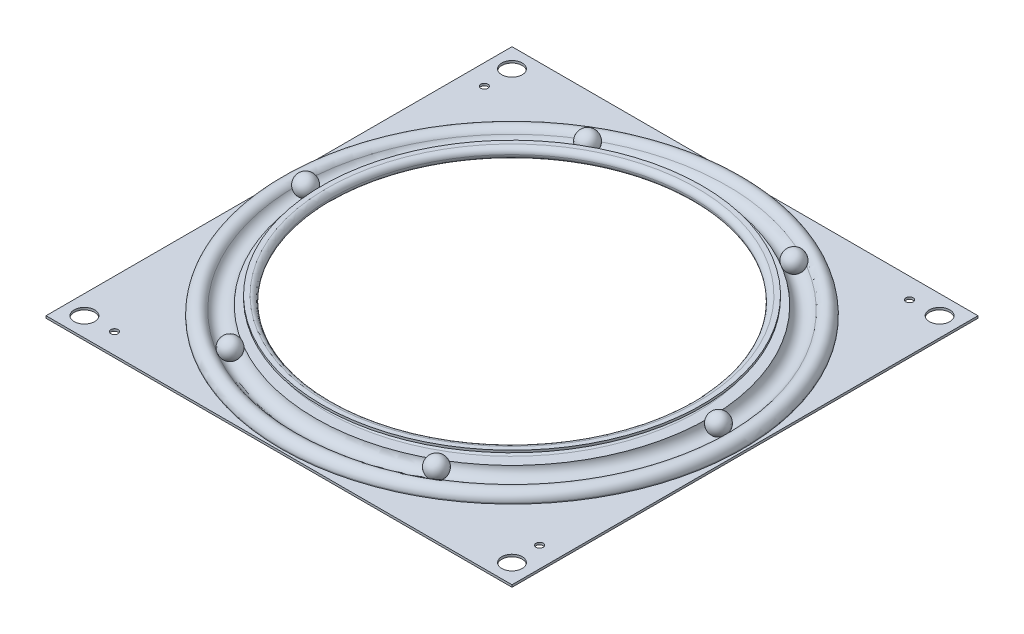
ISO-10303-21;
HEADER;
FILE_DESCRIPTION(('STEP AP214'),'2;1');
FILE_NAME('part.step','',(''),(''),'','','');
FILE_SCHEMA(('AUTOMOTIVE_DESIGN { 1 0 10303 214 1 1 1 1 }'));
ENDSEC;
DATA;
#1=APPLICATION_CONTEXT('core data for automotive mechanical design processes');
#2=APPLICATION_PROTOCOL_DEFINITION('international standard','automotive_design',2000,#1);
#3=PRODUCT_CONTEXT('',#1,'mechanical');
#4=PRODUCT('Part','Part','',(#3));
#5=PRODUCT_RELATED_PRODUCT_CATEGORY('part','',(#4));
#6=PRODUCT_DEFINITION_FORMATION('','',#4);
#7=PRODUCT_DEFINITION_CONTEXT('part definition',#1,'design');
#8=PRODUCT_DEFINITION('design','',#6,#7);
#9=PRODUCT_DEFINITION_SHAPE('','',#8);
#10=(LENGTH_UNIT() NAMED_UNIT(*) SI_UNIT(.MILLI.,.METRE.));
#11=(NAMED_UNIT(*) PLANE_ANGLE_UNIT() SI_UNIT($,.RADIAN.));
#12=(NAMED_UNIT(*) SI_UNIT($,.STERADIAN.) SOLID_ANGLE_UNIT());
#13=UNCERTAINTY_MEASURE_WITH_UNIT(LENGTH_MEASURE(1.E-05),#10,'distance_accuracy_value','');
#14=(GEOMETRIC_REPRESENTATION_CONTEXT(3) GLOBAL_UNCERTAINTY_ASSIGNED_CONTEXT((#13)) GLOBAL_UNIT_ASSIGNED_CONTEXT((#10,
#11,#12)) REPRESENTATION_CONTEXT('',''));
#15=CARTESIAN_POINT('',(0.,0.,0.));
#16=DIRECTION('',(0.,0.,1.));
#17=DIRECTION('',(1.,0.,0.));
#18=AXIS2_PLACEMENT_3D('',#15,#16,#17);
#19=CARTESIAN_POINT('',(34.1090250000007,-0.761999999999995,-59.0785642966366));
#20=DIRECTION('',(0.,1.,0.));
#21=DIRECTION('',(0.50000000000001,0.,-0.866025403784433));
#22=AXIS2_PLACEMENT_3D('',#19,#20,#21);
#23=SPHERICAL_SURFACE('',#22,3.27659999999999);
#24=CARTESIAN_POINT('',(34.1090250000007,2.5146,-59.0785642966366));
#25=VERTEX_POINT('',#24);
#26=VERTEX_LOOP('',#25);
#27=FACE_BOUND('',#26,.T.);
#28=ADVANCED_FACE('F41',(#27),#23,.T.);
#29=CLOSED_SHELL('',(#28));
#30=MANIFOLD_SOLID_BREP('B2',#29);
#31=CARTESIAN_POINT('',(-34.1090249999995,-0.761999999999995,-59.0785642966373));
#32=DIRECTION('',(0.,1.,0.));
#33=DIRECTION('',(-0.499999999999992,0.,-0.866025403784443));
#34=AXIS2_PLACEMENT_3D('',#31,#32,#33);
#35=SPHERICAL_SURFACE('',#34,3.27659999999999);
#36=CARTESIAN_POINT('',(-34.1090249999995,2.5146,-59.0785642966373));
#37=VERTEX_POINT('',#36);
#38=VERTEX_LOOP('',#37);
#39=FACE_BOUND('',#38,.T.);
#40=ADVANCED_FACE('F59',(#39),#35,.T.);
#41=CLOSED_SHELL('',(#40));
#42=MANIFOLD_SOLID_BREP('B6',#41);
#43=CARTESIAN_POINT('',(-68.21805,-0.761999999999995,-4.76364373004656E-13));
#44=DIRECTION('',(0.,1.,0.));
#45=DIRECTION('',(-1.,0.,0.));
#46=AXIS2_PLACEMENT_3D('',#43,#44,#45);
#47=SPHERICAL_SURFACE('',#46,3.27659999999999);
#48=CARTESIAN_POINT('',(-68.21805,2.5146,-4.76364373004656E-13));
#49=VERTEX_POINT('',#48);
#50=VERTEX_LOOP('',#49);
#51=FACE_BOUND('',#50,.T.);
#52=ADVANCED_FACE('F77',(#51),#47,.T.);
#53=CLOSED_SHELL('',(#52));
#54=MANIFOLD_SOLID_BREP('B37',#53);
#55=CARTESIAN_POINT('',(-34.1090250000003,-0.761999999999995,59.0785642966369));
#56=DIRECTION('',(0.,1.,0.));
#57=DIRECTION('',(-0.500000000000004,0.,0.866025403784436));
#58=AXIS2_PLACEMENT_3D('',#55,#56,#57);
#59=SPHERICAL_SURFACE('',#58,3.27659999999999);
#60=CARTESIAN_POINT('',(-34.1090250000003,2.5146,59.0785642966369));
#61=VERTEX_POINT('',#60);
#62=VERTEX_LOOP('',#61);
#63=FACE_BOUND('',#62,.T.);
#64=ADVANCED_FACE('F95',(#63),#59,.T.);
#65=CLOSED_SHELL('',(#64));
#66=MANIFOLD_SOLID_BREP('B55',#65);
#67=CARTESIAN_POINT('',(34.1090249999999,-0.761999999999995,59.0785642966371));
#68=DIRECTION('',(0.,1.,0.));
#69=DIRECTION('',(0.499999999999998,0.,0.86602540378444));
#70=AXIS2_PLACEMENT_3D('',#67,#68,#69);
#71=SPHERICAL_SURFACE('',#70,3.27659999999999);
#72=CARTESIAN_POINT('',(34.1090249999999,2.5146,59.0785642966371));
#73=VERTEX_POINT('',#72);
#74=VERTEX_LOOP('',#73);
#75=FACE_BOUND('',#74,.T.);
#76=ADVANCED_FACE('F113',(#75),#71,.T.);
#77=CLOSED_SHELL('',(#76));
#78=MANIFOLD_SOLID_BREP('B73',#77);
#79=CARTESIAN_POINT('',(68.21805,-0.761999999999995,0.));
#80=DIRECTION('',(0.,1.,0.));
#81=DIRECTION('',(1.,0.,0.));
#82=AXIS2_PLACEMENT_3D('',#79,#80,#81);
#83=SPHERICAL_SURFACE('',#82,3.27659999999999);
#84=CARTESIAN_POINT('',(68.21805,2.5146,0.));
#85=VERTEX_POINT('',#84);
#86=VERTEX_LOOP('',#85);
#87=FACE_BOUND('',#86,.T.);
#88=ADVANCED_FACE('F134',(#87),#83,.T.);
#89=CLOSED_SHELL('',(#88));
#90=MANIFOLD_SOLID_BREP('B91',#89);
#91=CARTESIAN_POINT('',(0.,0.,0.));
#92=DIRECTION('',(0.,1.,0.));
#93=DIRECTION('',(0.,0.,1.));
#94=AXIS2_PLACEMENT_3D('',#91,#92,#93);
#95=TOROIDAL_SURFACE('',#94,61.214,1.778);
#96=CARTESIAN_POINT('',(0.,-1.77799999999999,0.));
#97=DIRECTION('',(0.,1.,0.));
#98=DIRECTION('',(0.,0.,1.));
#99=AXIS2_PLACEMENT_3D('',#96,#97,#98);
#100=CIRCLE('',#99,61.214);
#101=CARTESIAN_POINT('',(0.,-1.77799999999999,61.214));
#102=VERTEX_POINT('',#101);
#103=EDGE_CURVE('E228',#102,#102,#100,.T.);
#104=ORIENTED_EDGE('',*,*,#103,.F.);
#105=EDGE_LOOP('',(#104));
#106=FACE_BOUND('',#105,.T.);
#107=CARTESIAN_POINT('',(0.,0.,0.));
#108=DIRECTION('',(0.,1.,0.));
#109=DIRECTION('',(0.,0.,1.));
#110=AXIS2_PLACEMENT_3D('',#107,#108,#109);
#111=CIRCLE('',#110,59.436);
#112=CARTESIAN_POINT('',(0.,0.,59.436));
#113=VERTEX_POINT('',#112);
#114=EDGE_CURVE('E132',#113,#113,#111,.T.);
#115=ORIENTED_EDGE('',*,*,#114,.T.);
#116=EDGE_LOOP('',(#115));
#117=FACE_BOUND('',#116,.T.);
#118=ADVANCED_FACE('F146',(#106,#117),#95,.T.);
#119=CARTESIAN_POINT('',(75.5293408614699,-4.82599999999999,0.));
#120=DIRECTION('',(0.,1.,0.));
#121=DIRECTION('',(0.,0.,1.));
#122=AXIS2_PLACEMENT_3D('',#119,#120,#121);
#123=PLANE('',#122);
#124=CARTESIAN_POINT('',(-61.1251000000008,-4.82599999999999,70.2436999999994));
#125=DIRECTION('',(0.,1.,0.));
#126=DIRECTION('',(0.,0.,1.));
#127=AXIS2_PLACEMENT_3D('',#124,#125,#126);
#128=CIRCLE('',#127,1.19062499999999);
#129=CARTESIAN_POINT('',(-61.1251000000008,-4.82599999999999,71.4343249999993));
#130=VERTEX_POINT('',#129);
#131=EDGE_CURVE('E545',#130,#130,#128,.T.);
#132=ORIENTED_EDGE('',*,*,#131,.T.);
#133=EDGE_LOOP('',(#132));
#134=FACE_BOUND('',#133,.T.);
#135=CARTESIAN_POINT('',(70.2436999999996,-4.82599999999999,61.1251000000005));
#136=DIRECTION('',(0.,1.,0.));
#137=DIRECTION('',(0.,0.,1.));
#138=AXIS2_PLACEMENT_3D('',#135,#136,#137);
#139=CIRCLE('',#138,1.19062499999999);
#140=CARTESIAN_POINT('',(70.2436999999996,-4.82599999999999,62.3157250000005));
#141=VERTEX_POINT('',#140);
#142=EDGE_CURVE('E549',#141,#141,#139,.T.);
#143=ORIENTED_EDGE('',*,*,#142,.T.);
#144=EDGE_LOOP('',(#143));
#145=FACE_BOUND('',#144,.T.);
#146=CARTESIAN_POINT('',(61.1251000000003,-4.82599999999999,-70.2436999999998));
#147=DIRECTION('',(0.,1.,0.));
#148=DIRECTION('',(0.,0.,1.));
#149=AXIS2_PLACEMENT_3D('',#146,#147,#148);
#150=CIRCLE('',#149,1.19062499999999);
#151=CARTESIAN_POINT('',(61.1251000000003,-4.82599999999999,-69.0530749999998));
#152=VERTEX_POINT('',#151);
#153=EDGE_CURVE('E558',#152,#152,#150,.T.);
#154=ORIENTED_EDGE('',*,*,#153,.T.);
#155=EDGE_LOOP('',(#154));
#156=FACE_BOUND('',#155,.T.);
#157=CARTESIAN_POINT('',(-70.2437,-4.82599999999999,-61.1251));
#158=DIRECTION('',(0.,1.,0.));
#159=DIRECTION('',(0.,0.,1.));
#160=AXIS2_PLACEMENT_3D('',#157,#158,#159);
#161=CIRCLE('',#160,1.19062499999999);
#162=CARTESIAN_POINT('',(-70.2437,-4.82599999999999,-59.934475));
#163=VERTEX_POINT('',#162);
#164=EDGE_CURVE('E564',#163,#163,#161,.T.);
#165=ORIENTED_EDGE('',*,*,#164,.T.);
#166=EDGE_LOOP('',(#165));
#167=FACE_BOUND('',#166,.T.);
#168=CARTESIAN_POINT('',(70.6501,-4.826,-70.6501));
#169=DIRECTION('',(0.,1.,0.));
#170=DIRECTION('',(0.,0.,1.));
#171=AXIS2_PLACEMENT_3D('',#168,#169,#170);
#172=CIRCLE('',#171,3.3782);
#173=CARTESIAN_POINT('',(70.6501,-4.826,-67.2719));
#174=VERTEX_POINT('',#173);
#175=EDGE_CURVE('E567',#174,#174,#172,.T.);
#176=ORIENTED_EDGE('',*,*,#175,.T.);
#177=EDGE_LOOP('',(#176));
#178=FACE_BOUND('',#177,.T.);
#179=CARTESIAN_POINT('',(70.6501,-4.826,70.6501));
#180=DIRECTION('',(0.,1.,0.));
#181=DIRECTION('',(0.,0.,1.));
#182=AXIS2_PLACEMENT_3D('',#179,#180,#181);
#183=CIRCLE('',#182,3.3782);
#184=CARTESIAN_POINT('',(70.6501,-4.826,74.0283));
#185=VERTEX_POINT('',#184);
#186=EDGE_CURVE('E573',#185,#185,#183,.T.);
#187=ORIENTED_EDGE('',*,*,#186,.T.);
#188=EDGE_LOOP('',(#187));
#189=FACE_BOUND('',#188,.T.);
#190=CARTESIAN_POINT('',(-70.6501,-4.826,-70.6501));
#191=DIRECTION('',(0.,1.,0.));
#192=DIRECTION('',(0.,0.,1.));
#193=AXIS2_PLACEMENT_3D('',#190,#191,#192);
#194=CIRCLE('',#193,3.3782);
#195=CARTESIAN_POINT('',(-70.6501,-4.826,-67.2719));
#196=VERTEX_POINT('',#195);
#197=EDGE_CURVE('E579',#196,#196,#194,.T.);
#198=ORIENTED_EDGE('',*,*,#197,.T.);
#199=EDGE_LOOP('',(#198));
#200=FACE_BOUND('',#199,.T.);
#201=CARTESIAN_POINT('',(-70.6501,-4.826,70.6501));
#202=DIRECTION('',(0.,1.,0.));
#203=DIRECTION('',(0.,0.,1.));
#204=AXIS2_PLACEMENT_3D('',#201,#202,#203);
#205=CIRCLE('',#204,3.3782);
#206=CARTESIAN_POINT('',(-70.6501,-4.826,74.0283));
#207=VERTEX_POINT('',#206);
#208=EDGE_CURVE('E585',#207,#207,#205,.T.);
#209=ORIENTED_EDGE('',*,*,#208,.T.);
#210=EDGE_LOOP('',(#209));
#211=FACE_BOUND('',#210,.T.);
#212=DIRECTION('',(1.,0.,0.));
#213=VECTOR('',#212,1.);
#214=CARTESIAN_POINT('',(77.0001,-4.82599999999999,-77.0001));
#215=LINE('',#214,#213);
#216=CARTESIAN_POINT('',(-77.0001,-4.82599999999999,-77.0001));
#217=VERTEX_POINT('',#216);
#218=CARTESIAN_POINT('',(77.0001,-4.82599999999999,-77.0001));
#219=VERTEX_POINT('',#218);
#220=EDGE_CURVE('E206',#217,#219,#215,.T.);
#221=ORIENTED_EDGE('',*,*,#220,.T.);
#222=DIRECTION('',(0.,0.,1.));
#223=VECTOR('',#222,1.);
#224=CARTESIAN_POINT('',(77.0001,-4.82599999999999,77.0001));
#225=LINE('',#224,#223);
#226=CARTESIAN_POINT('',(77.0001,-4.82599999999999,77.0001));
#227=VERTEX_POINT('',#226);
#228=EDGE_CURVE('E594',#219,#227,#225,.T.);
#229=ORIENTED_EDGE('',*,*,#228,.T.);
#230=DIRECTION('',(-1.,0.,0.));
#231=VECTOR('',#230,1.);
#232=CARTESIAN_POINT('',(77.0001,-4.82599999999999,77.0001));
#233=LINE('',#232,#231);
#234=CARTESIAN_POINT('',(-77.0001,-4.82599999999999,77.0001));
#235=VERTEX_POINT('',#234);
#236=EDGE_CURVE('E591',#227,#235,#233,.T.);
#237=ORIENTED_EDGE('',*,*,#236,.T.);
#238=DIRECTION('',(0.,0.,-1.));
#239=VECTOR('',#238,1.);
#240=CARTESIAN_POINT('',(-77.0001,-4.82599999999999,77.0001));
#241=LINE('',#240,#239);
#242=EDGE_CURVE('E219',#235,#217,#241,.T.);
#243=ORIENTED_EDGE('',*,*,#242,.T.);
#244=EDGE_LOOP('',(#221,#229,#237,#243));
#245=FACE_BOUND('',#244,.T.);
#246=CARTESIAN_POINT('',(0.,-4.82599999999999,0.));
#247=DIRECTION('',(0.,1.,0.));
#248=DIRECTION('',(0.,0.,1.));
#249=AXIS2_PLACEMENT_3D('',#246,#247,#248);
#250=CIRCLE('',#249,75.5293408614699);
#251=CARTESIAN_POINT('',(0.,-4.82599999999999,75.5293408614699));
#252=VERTEX_POINT('',#251);
#253=EDGE_CURVE('E215',#252,#252,#250,.T.);
#254=ORIENTED_EDGE('',*,*,#253,.T.);
#255=EDGE_LOOP('',(#254));
#256=FACE_BOUND('',#255,.T.);
#257=ADVANCED_FACE('F148',(#134,#145,#156,#167,#178,#189,#200,#211,#245,#256),#123,.F.);
#258=CARTESIAN_POINT('',(75.5293408614699,-4.0894,0.));
#259=DIRECTION('',(0.,1.,0.));
#260=DIRECTION('',(0.,0.,1.));
#261=AXIS2_PLACEMENT_3D('',#258,#259,#260);
#262=PLANE('',#261);
#263=CARTESIAN_POINT('',(-61.1251000000008,-4.08939999999999,70.2436999999994));
#264=DIRECTION('',(0.,1.,0.));
#265=DIRECTION('',(0.,0.,1.));
#266=AXIS2_PLACEMENT_3D('',#263,#264,#265);
#267=CIRCLE('',#266,1.19062499999999);
#268=CARTESIAN_POINT('',(-61.1251000000008,-4.08939999999999,71.4343249999993));
#269=VERTEX_POINT('',#268);
#270=EDGE_CURVE('E542',#269,#269,#267,.T.);
#271=ORIENTED_EDGE('',*,*,#270,.F.);
#272=EDGE_LOOP('',(#271));
#273=FACE_BOUND('',#272,.T.);
#274=CARTESIAN_POINT('',(70.2436999999996,-4.08939999999999,61.1251000000005));
#275=DIRECTION('',(0.,1.,0.));
#276=DIRECTION('',(0.,0.,1.));
#277=AXIS2_PLACEMENT_3D('',#274,#275,#276);
#278=CIRCLE('',#277,1.19062499999999);
#279=CARTESIAN_POINT('',(70.2436999999996,-4.08939999999999,62.3157250000005));
#280=VERTEX_POINT('',#279);
#281=EDGE_CURVE('E546',#280,#280,#278,.T.);
#282=ORIENTED_EDGE('',*,*,#281,.F.);
#283=EDGE_LOOP('',(#282));
#284=FACE_BOUND('',#283,.T.);
#285=CARTESIAN_POINT('',(61.1251000000003,-4.08939999999999,-70.2436999999998));
#286=DIRECTION('',(0.,1.,0.));
#287=DIRECTION('',(0.,0.,1.));
#288=AXIS2_PLACEMENT_3D('',#285,#286,#287);
#289=CIRCLE('',#288,1.19062499999999);
#290=CARTESIAN_POINT('',(61.1251000000003,-4.08939999999999,-69.0530749999998));
#291=VERTEX_POINT('',#290);
#292=EDGE_CURVE('E555',#291,#291,#289,.T.);
#293=ORIENTED_EDGE('',*,*,#292,.F.);
#294=EDGE_LOOP('',(#293));
#295=FACE_BOUND('',#294,.T.);
#296=CARTESIAN_POINT('',(-70.2437,-4.08939999999999,-61.1251));
#297=DIRECTION('',(0.,1.,0.));
#298=DIRECTION('',(0.,0.,1.));
#299=AXIS2_PLACEMENT_3D('',#296,#297,#298);
#300=CIRCLE('',#299,1.19062499999999);
#301=CARTESIAN_POINT('',(-70.2437,-4.08939999999999,-59.934475));
#302=VERTEX_POINT('',#301);
#303=EDGE_CURVE('E561',#302,#302,#300,.T.);
#304=ORIENTED_EDGE('',*,*,#303,.F.);
#305=EDGE_LOOP('',(#304));
#306=FACE_BOUND('',#305,.T.);
#307=CARTESIAN_POINT('',(70.6501,-4.0894,-70.6501));
#308=DIRECTION('',(0.,1.,0.));
#309=DIRECTION('',(0.,0.,1.));
#310=AXIS2_PLACEMENT_3D('',#307,#308,#309);
#311=CIRCLE('',#310,3.3782);
#312=CARTESIAN_POINT('',(70.6501,-4.0894,-67.2719));
#313=VERTEX_POINT('',#312);
#314=EDGE_CURVE('E570',#313,#313,#311,.T.);
#315=ORIENTED_EDGE('',*,*,#314,.F.);
#316=EDGE_LOOP('',(#315));
#317=FACE_BOUND('',#316,.T.);
#318=CARTESIAN_POINT('',(70.6501,-4.0894,70.6501));
#319=DIRECTION('',(0.,1.,0.));
#320=DIRECTION('',(0.,0.,1.));
#321=AXIS2_PLACEMENT_3D('',#318,#319,#320);
#322=CIRCLE('',#321,3.3782);
#323=CARTESIAN_POINT('',(70.6501,-4.0894,74.0283));
#324=VERTEX_POINT('',#323);
#325=EDGE_CURVE('E576',#324,#324,#322,.T.);
#326=ORIENTED_EDGE('',*,*,#325,.F.);
#327=EDGE_LOOP('',(#326));
#328=FACE_BOUND('',#327,.T.);
#329=CARTESIAN_POINT('',(-70.6501,-4.0894,-70.6501));
#330=DIRECTION('',(0.,1.,0.));
#331=DIRECTION('',(0.,0.,1.));
#332=AXIS2_PLACEMENT_3D('',#329,#330,#331);
#333=CIRCLE('',#332,3.3782);
#334=CARTESIAN_POINT('',(-70.6501,-4.0894,-67.2719));
#335=VERTEX_POINT('',#334);
#336=EDGE_CURVE('E582',#335,#335,#333,.T.);
#337=ORIENTED_EDGE('',*,*,#336,.F.);
#338=EDGE_LOOP('',(#337));
#339=FACE_BOUND('',#338,.T.);
#340=CARTESIAN_POINT('',(-70.6501,-4.0894,70.6501));
#341=DIRECTION('',(0.,1.,0.));
#342=DIRECTION('',(0.,0.,1.));
#343=AXIS2_PLACEMENT_3D('',#340,#341,#342);
#344=CIRCLE('',#343,3.3782);
#345=CARTESIAN_POINT('',(-70.6501,-4.0894,74.0283));
#346=VERTEX_POINT('',#345);
#347=EDGE_CURVE('E193',#346,#346,#344,.T.);
#348=ORIENTED_EDGE('',*,*,#347,.F.);
#349=EDGE_LOOP('',(#348));
#350=FACE_BOUND('',#349,.T.);
#351=DIRECTION('',(0.,0.,-1.));
#352=VECTOR('',#351,1.);
#353=CARTESIAN_POINT('',(-77.0001,-4.0894,77.0001));
#354=LINE('',#353,#352);
#355=CARTESIAN_POINT('',(-77.0001,-4.0894,77.0001));
#356=VERTEX_POINT('',#355);
#357=CARTESIAN_POINT('',(-77.0001,-4.0894,-77.0001));
#358=VERTEX_POINT('',#357);
#359=EDGE_CURVE('E187',#356,#358,#354,.T.);
#360=ORIENTED_EDGE('',*,*,#359,.F.);
#361=DIRECTION('',(-1.,0.,0.));
#362=VECTOR('',#361,1.);
#363=CARTESIAN_POINT('',(77.0001,-4.0894,77.0001));
#364=LINE('',#363,#362);
#365=CARTESIAN_POINT('',(77.0001,-4.0894,77.0001));
#366=VERTEX_POINT('',#365);
#367=EDGE_CURVE('E168',#366,#356,#364,.T.);
#368=ORIENTED_EDGE('',*,*,#367,.F.);
#369=DIRECTION('',(0.,0.,1.));
#370=VECTOR('',#369,1.);
#371=CARTESIAN_POINT('',(77.0001,-4.0894,77.0001));
#372=LINE('',#371,#370);
#373=CARTESIAN_POINT('',(77.0001,-4.0894,-77.0001));
#374=VERTEX_POINT('',#373);
#375=EDGE_CURVE('E162',#374,#366,#372,.T.);
#376=ORIENTED_EDGE('',*,*,#375,.F.);
#377=DIRECTION('',(1.,0.,0.));
#378=VECTOR('',#377,1.);
#379=CARTESIAN_POINT('',(77.0001,-4.0894,-77.0001));
#380=LINE('',#379,#378);
#381=EDGE_CURVE('E183',#358,#374,#380,.T.);
#382=ORIENTED_EDGE('',*,*,#381,.F.);
#383=EDGE_LOOP('',(#360,#368,#376,#382));
#384=FACE_BOUND('',#383,.T.);
#385=CARTESIAN_POINT('',(0.,-4.08939999999999,0.));
#386=DIRECTION('',(0.,1.,0.));
#387=DIRECTION('',(0.,0.,1.));
#388=AXIS2_PLACEMENT_3D('',#385,#386,#387);
#389=CIRCLE('',#388,76.26594086147);
#390=CARTESIAN_POINT('',(0.,-4.08939999999999,76.26594086147));
#391=VERTEX_POINT('',#390);
#392=EDGE_CURVE('E155',#391,#391,#389,.T.);
#393=ORIENTED_EDGE('',*,*,#392,.F.);
#394=EDGE_LOOP('',(#393));
#395=FACE_BOUND('',#394,.T.);
#396=ADVANCED_FACE('F185',(#273,#284,#295,#306,#317,#328,#339,#350,#384,#395),#262,.T.);
#397=CARTESIAN_POINT('',(0.,21.7127262600922,0.));
#398=DIRECTION('',(0.,1.,0.));
#399=DIRECTION('',(0.,0.,1.));
#400=AXIS2_PLACEMENT_3D('',#397,#398,#399);
#401=CYLINDRICAL_SURFACE('',#400,76.26594086147);
#402=ORIENTED_EDGE('',*,*,#392,.T.);
#403=EDGE_LOOP('',(#402));
#404=FACE_BOUND('',#403,.T.);
#405=CARTESIAN_POINT('',(0.,-3.81,0.));
#406=DIRECTION('',(0.,1.,0.));
#407=DIRECTION('',(0.,0.,1.));
#408=AXIS2_PLACEMENT_3D('',#405,#406,#407);
#409=CIRCLE('',#408,76.26594086147);
#410=CARTESIAN_POINT('',(0.,-3.81,76.26594086147));
#411=VERTEX_POINT('',#410);
#412=EDGE_CURVE('E252',#411,#411,#409,.T.);
#413=ORIENTED_EDGE('',*,*,#412,.F.);
#414=EDGE_LOOP('',(#413));
#415=FACE_BOUND('',#414,.T.);
#416=ADVANCED_FACE('F257',(#404,#415),#401,.T.);
#417=CARTESIAN_POINT('',(0.,-3.81,0.));
#418=DIRECTION('',(0.,1.,0.));
#419=DIRECTION('',(0.,0.,1.));
#420=AXIS2_PLACEMENT_3D('',#417,#418,#419);
#421=TOROIDAL_SURFACE('',#420,73.49734086147,2.76860000000001);
#422=ORIENTED_EDGE('',*,*,#412,.T.);
#423=EDGE_LOOP('',(#422));
#424=FACE_BOUND('',#423,.T.);
#425=CARTESIAN_POINT('',(0.,-2.4257,0.));
#426=DIRECTION('',(0.,1.,0.));
#427=DIRECTION('',(0.,0.,1.));
#428=AXIS2_PLACEMENT_3D('',#425,#426,#427);
#429=CIRCLE('',#428,71.0996629285523);
#430=CARTESIAN_POINT('',(0.,-2.4257,71.0996629285523));
#431=VERTEX_POINT('',#430);
#432=EDGE_CURVE('E249',#431,#431,#429,.T.);
#433=ORIENTED_EDGE('',*,*,#432,.F.);
#434=EDGE_LOOP('',(#433));
#435=FACE_BOUND('',#434,.T.);
#436=ADVANCED_FACE('F265',(#424,#435),#421,.T.);
#437=CARTESIAN_POINT('',(0.,-0.761999999999995,0.));
#438=DIRECTION('',(0.,1.,0.));
#439=DIRECTION('',(0.,0.,1.));
#440=AXIS2_PLACEMENT_3D('',#437,#438,#439);
#441=TOROIDAL_SURFACE('',#440,68.21805,3.32739999999999);
#442=ORIENTED_EDGE('',*,*,#432,.T.);
#443=EDGE_LOOP('',(#442));
#444=FACE_BOUND('',#443,.T.);
#445=CARTESIAN_POINT('',(0.,-1.0414,0.));
#446=DIRECTION('',(0.,1.,0.));
#447=DIRECTION('',(0.,0.,1.));
#448=AXIS2_PLACEMENT_3D('',#445,#446,#447);
#449=CIRCLE('',#448,64.9024012851932);
#450=CARTESIAN_POINT('',(0.,-1.0414,64.9024012851932));
#451=VERTEX_POINT('',#450);
#452=EDGE_CURVE('E246',#451,#451,#449,.T.);
#453=ORIENTED_EDGE('',*,*,#452,.F.);
#454=EDGE_LOOP('',(#453));
#455=FACE_BOUND('',#454,.T.);
#456=ADVANCED_FACE('F315',(#444,#455),#441,.F.);
#457=CARTESIAN_POINT('',(61.214,-1.0414,0.));
#458=DIRECTION('',(0.,1.,0.));
#459=DIRECTION('',(0.,0.,1.));
#460=AXIS2_PLACEMENT_3D('',#457,#458,#459);
#461=PLANE('',#460);
#462=ORIENTED_EDGE('',*,*,#452,.T.);
#463=EDGE_LOOP('',(#462));
#464=FACE_BOUND('',#463,.T.);
#465=CARTESIAN_POINT('',(0.,-1.0414,0.));
#466=DIRECTION('',(0.,1.,0.));
#467=DIRECTION('',(0.,0.,1.));
#468=AXIS2_PLACEMENT_3D('',#465,#466,#467);
#469=CIRCLE('',#468,61.214);
#470=CARTESIAN_POINT('',(0.,-1.0414,61.214));
#471=VERTEX_POINT('',#470);
#472=EDGE_CURVE('E243',#471,#471,#469,.T.);
#473=ORIENTED_EDGE('',*,*,#472,.F.);
#474=EDGE_LOOP('',(#473));
#475=FACE_BOUND('',#474,.T.);
#476=ADVANCED_FACE('F311',(#464,#475),#461,.T.);
#477=CARTESIAN_POINT('',(0.,0.,0.));
#478=DIRECTION('',(0.,1.,0.));
#479=DIRECTION('',(0.,0.,1.));
#480=AXIS2_PLACEMENT_3D('',#477,#478,#479);
#481=TOROIDAL_SURFACE('',#480,61.214,1.0414);
#482=ORIENTED_EDGE('',*,*,#472,.T.);
#483=EDGE_LOOP('',(#482));
#484=FACE_BOUND('',#483,.T.);
#485=CARTESIAN_POINT('',(0.,1.0414,0.));
#486=DIRECTION('',(0.,1.,0.));
#487=DIRECTION('',(0.,0.,1.));
#488=AXIS2_PLACEMENT_3D('',#485,#486,#487);
#489=CIRCLE('',#488,61.214);
#490=CARTESIAN_POINT('',(0.,1.0414,61.214));
#491=VERTEX_POINT('',#490);
#492=EDGE_CURVE('E240',#491,#491,#489,.T.);
#493=ORIENTED_EDGE('',*,*,#492,.F.);
#494=EDGE_LOOP('',(#493));
#495=FACE_BOUND('',#494,.T.);
#496=ADVANCED_FACE('F305',(#484,#495),#481,.F.);
#497=CARTESIAN_POINT('',(62.7485494601266,1.0414,0.));
#498=DIRECTION('',(0.,-1.,0.));
#499=DIRECTION('',(0.,0.,-1.));
#500=AXIS2_PLACEMENT_3D('',#497,#498,#499);
#501=PLANE('',#500);
#502=ORIENTED_EDGE('',*,*,#492,.T.);
#503=EDGE_LOOP('',(#502));
#504=FACE_BOUND('',#503,.T.);
#505=CARTESIAN_POINT('',(0.,1.0414,0.));
#506=DIRECTION('',(0.,1.,0.));
#507=DIRECTION('',(0.,0.,1.));
#508=AXIS2_PLACEMENT_3D('',#505,#506,#507);
#509=CIRCLE('',#508,62.7485494601266);
#510=CARTESIAN_POINT('',(0.,1.0414,62.7485494601266));
#511=VERTEX_POINT('',#510);
#512=EDGE_CURVE('E237',#511,#511,#509,.T.);
#513=ORIENTED_EDGE('',*,*,#512,.F.);
#514=EDGE_LOOP('',(#513));
#515=FACE_BOUND('',#514,.T.);
#516=ADVANCED_FACE('F299',(#504,#515),#501,.T.);
#517=CARTESIAN_POINT('',(0.,21.7127262600922,0.));
#518=DIRECTION('',(0.,1.,0.));
#519=DIRECTION('',(0.,0.,1.));
#520=AXIS2_PLACEMENT_3D('',#517,#518,#519);
#521=CYLINDRICAL_SURFACE('',#520,62.7485494601266);
#522=ORIENTED_EDGE('',*,*,#512,.T.);
#523=EDGE_LOOP('',(#522));
#524=FACE_BOUND('',#523,.T.);
#525=CARTESIAN_POINT('',(0.,1.778,0.));
#526=DIRECTION('',(0.,1.,0.));
#527=DIRECTION('',(0.,0.,1.));
#528=AXIS2_PLACEMENT_3D('',#525,#526,#527);
#529=CIRCLE('',#528,62.7485494601266);
#530=CARTESIAN_POINT('',(0.,1.778,62.7485494601266));
#531=VERTEX_POINT('',#530);
#532=EDGE_CURVE('E234',#531,#531,#529,.T.);
#533=ORIENTED_EDGE('',*,*,#532,.F.);
#534=EDGE_LOOP('',(#533));
#535=FACE_BOUND('',#534,.T.);
#536=ADVANCED_FACE('F290',(#524,#535),#521,.T.);
#537=CARTESIAN_POINT('',(62.7485494601266,1.778,0.));
#538=DIRECTION('',(0.,-1.,0.));
#539=DIRECTION('',(0.,0.,-1.));
#540=AXIS2_PLACEMENT_3D('',#537,#538,#539);
#541=PLANE('',#540);
#542=CARTESIAN_POINT('',(0.,1.778,0.));
#543=DIRECTION('',(0.,1.,0.));
#544=DIRECTION('',(0.,0.,1.));
#545=AXIS2_PLACEMENT_3D('',#542,#543,#544);
#546=CIRCLE('',#545,61.214);
#547=CARTESIAN_POINT('',(0.,1.778,61.214));
#548=VERTEX_POINT('',#547);
#549=EDGE_CURVE('E231',#548,#548,#546,.T.);
#550=ORIENTED_EDGE('',*,*,#549,.F.);
#551=EDGE_LOOP('',(#550));
#552=FACE_BOUND('',#551,.T.);
#553=ORIENTED_EDGE('',*,*,#532,.T.);
#554=EDGE_LOOP('',(#553));
#555=FACE_BOUND('',#554,.T.);
#556=ADVANCED_FACE('F282',(#552,#555),#541,.F.);
#557=ORIENTED_EDGE('',*,*,#114,.F.);
#558=EDGE_LOOP('',(#557));
#559=FACE_BOUND('',#558,.T.);
#560=ORIENTED_EDGE('',*,*,#549,.T.);
#561=EDGE_LOOP('',(#560));
#562=FACE_BOUND('',#561,.T.);
#563=ADVANCED_FACE('F273',(#559,#562),#95,.T.);
#564=CARTESIAN_POINT('',(61.214,-1.778,0.));
#565=DIRECTION('',(0.,1.,0.));
#566=DIRECTION('',(0.,0.,1.));
#567=AXIS2_PLACEMENT_3D('',#564,#565,#566);
#568=PLANE('',#567);
#569=CARTESIAN_POINT('',(0.,-1.778,0.));
#570=DIRECTION('',(0.,1.,0.));
#571=DIRECTION('',(0.,0.,1.));
#572=AXIS2_PLACEMENT_3D('',#569,#570,#571);
#573=CIRCLE('',#572,64.2830989202533);
#574=CARTESIAN_POINT('',(0.,-1.778,64.2830989202533));
#575=VERTEX_POINT('',#574);
#576=EDGE_CURVE('E225',#575,#575,#573,.T.);
#577=ORIENTED_EDGE('',*,*,#576,.F.);
#578=EDGE_LOOP('',(#577));
#579=FACE_BOUND('',#578,.T.);
#580=ORIENTED_EDGE('',*,*,#103,.T.);
#581=EDGE_LOOP('',(#580));
#582=FACE_BOUND('',#581,.T.);
#583=ADVANCED_FACE('F281',(#579,#582),#568,.F.);
#584=CARTESIAN_POINT('',(0.,-0.761999999999995,0.));
#585=DIRECTION('',(0.,1.,0.));
#586=DIRECTION('',(0.,0.,1.));
#587=AXIS2_PLACEMENT_3D('',#584,#585,#586);
#588=TOROIDAL_SURFACE('',#587,68.21805,4.06399999999999);
#589=CARTESIAN_POINT('',(0.,-2.79399999999999,0.));
#590=DIRECTION('',(0.,1.,0.));
#591=DIRECTION('',(0.,0.,1.));
#592=AXIS2_PLACEMENT_3D('',#589,#590,#591);
#593=CIRCLE('',#592,71.73757724098);
#594=CARTESIAN_POINT('',(0.,-2.79399999999999,71.73757724098));
#595=VERTEX_POINT('',#594);
#596=EDGE_CURVE('E222',#595,#595,#593,.T.);
#597=ORIENTED_EDGE('',*,*,#596,.F.);
#598=EDGE_LOOP('',(#597));
#599=FACE_BOUND('',#598,.T.);
#600=ORIENTED_EDGE('',*,*,#576,.T.);
#601=EDGE_LOOP('',(#600));
#602=FACE_BOUND('',#601,.T.);
#603=ADVANCED_FACE('F288',(#599,#602),#588,.T.);
#604=CARTESIAN_POINT('',(0.,-3.81,0.));
#605=DIRECTION('',(0.,1.,0.));
#606=DIRECTION('',(0.,0.,1.));
#607=AXIS2_PLACEMENT_3D('',#604,#605,#606);
#608=TOROIDAL_SURFACE('',#607,73.49734086147,2.03200000000001);
#609=CARTESIAN_POINT('',(0.,-3.81,0.));
#610=DIRECTION('',(0.,1.,0.));
#611=DIRECTION('',(0.,0.,1.));
#612=AXIS2_PLACEMENT_3D('',#609,#610,#611);
#613=CIRCLE('',#612,75.5293408614699);
#614=CARTESIAN_POINT('',(0.,-3.81,75.5293408614699));
#615=VERTEX_POINT('',#614);
#616=EDGE_CURVE('E218',#615,#615,#613,.T.);
#617=ORIENTED_EDGE('',*,*,#616,.F.);
#618=EDGE_LOOP('',(#617));
#619=FACE_BOUND('',#618,.T.);
#620=ORIENTED_EDGE('',*,*,#596,.T.);
#621=EDGE_LOOP('',(#620));
#622=FACE_BOUND('',#621,.T.);
#623=ADVANCED_FACE('F378',(#619,#622),#608,.F.);
#624=CARTESIAN_POINT('',(0.,21.7127262600922,0.));
#625=DIRECTION('',(0.,1.,0.));
#626=DIRECTION('',(0.,0.,1.));
#627=AXIS2_PLACEMENT_3D('',#624,#625,#626);
#628=CYLINDRICAL_SURFACE('',#627,75.5293408614699);
#629=ORIENTED_EDGE('',*,*,#616,.T.);
#630=EDGE_LOOP('',(#629));
#631=FACE_BOUND('',#630,.T.);
#632=ORIENTED_EDGE('',*,*,#253,.F.);
#633=EDGE_LOOP('',(#632));
#634=FACE_BOUND('',#633,.T.);
#635=ADVANCED_FACE('F388',(#631,#634),#628,.F.);
#636=CARTESIAN_POINT('',(77.0001,213.699771448169,-77.0001));
#637=DIRECTION('',(0.,0.,-1.));
#638=DIRECTION('',(-1.,0.,0.));
#639=AXIS2_PLACEMENT_3D('',#636,#637,#638);
#640=PLANE('',#639);
#641=DIRECTION('',(0.,-1.,0.));
#642=VECTOR('',#641,1.);
#643=CARTESIAN_POINT('',(77.0001,213.699771448169,-77.0001));
#644=LINE('',#643,#642);
#645=EDGE_CURVE('E192',#374,#219,#644,.T.);
#646=ORIENTED_EDGE('',*,*,#645,.T.);
#647=ORIENTED_EDGE('',*,*,#220,.F.);
#648=DIRECTION('',(0.,-1.,0.));
#649=VECTOR('',#648,1.);
#650=CARTESIAN_POINT('',(-77.0001,213.699771448169,-77.0001));
#651=LINE('',#650,#649);
#652=EDGE_CURVE('E199',#358,#217,#651,.T.);
#653=ORIENTED_EDGE('',*,*,#652,.F.);
#654=ORIENTED_EDGE('',*,*,#381,.T.);
#655=EDGE_LOOP('',(#646,#647,#653,#654));
#656=FACE_BOUND('',#655,.T.);
#657=ADVANCED_FACE('F204',(#656),#640,.T.);
#658=CARTESIAN_POINT('',(-77.0001,213.699771448169,77.0001));
#659=DIRECTION('',(-1.,0.,0.));
#660=DIRECTION('',(0.,0.,1.));
#661=AXIS2_PLACEMENT_3D('',#658,#659,#660);
#662=PLANE('',#661);
#663=ORIENTED_EDGE('',*,*,#242,.F.);
#664=DIRECTION('',(0.,-1.,0.));
#665=VECTOR('',#664,1.);
#666=CARTESIAN_POINT('',(-77.0001,213.699771448169,77.0001));
#667=LINE('',#666,#665);
#668=EDGE_CURVE('E202',#356,#235,#667,.T.);
#669=ORIENTED_EDGE('',*,*,#668,.F.);
#670=ORIENTED_EDGE('',*,*,#359,.T.);
#671=ORIENTED_EDGE('',*,*,#652,.T.);
#672=EDGE_LOOP('',(#663,#669,#670,#671));
#673=FACE_BOUND('',#672,.T.);
#674=ADVANCED_FACE('F198',(#673),#662,.T.);
#675=CARTESIAN_POINT('',(77.0001,213.699771448169,77.0001));
#676=DIRECTION('',(0.,0.,1.));
#677=DIRECTION('',(1.,0.,0.));
#678=AXIS2_PLACEMENT_3D('',#675,#676,#677);
#679=PLANE('',#678);
#680=ORIENTED_EDGE('',*,*,#236,.F.);
#681=DIRECTION('',(0.,-1.,0.));
#682=VECTOR('',#681,1.);
#683=CARTESIAN_POINT('',(77.0001,213.699771448169,77.0001));
#684=LINE('',#683,#682);
#685=EDGE_CURVE('E211',#366,#227,#684,.T.);
#686=ORIENTED_EDGE('',*,*,#685,.F.);
#687=ORIENTED_EDGE('',*,*,#367,.T.);
#688=ORIENTED_EDGE('',*,*,#668,.T.);
#689=EDGE_LOOP('',(#680,#686,#687,#688));
#690=FACE_BOUND('',#689,.T.);
#691=ADVANCED_FACE('F417',(#690),#679,.T.);
#692=CARTESIAN_POINT('',(77.0001,213.699771448169,77.0001));
#693=DIRECTION('',(1.,0.,0.));
#694=DIRECTION('',(0.,0.,-1.));
#695=AXIS2_PLACEMENT_3D('',#692,#693,#694);
#696=PLANE('',#695);
#697=ORIENTED_EDGE('',*,*,#228,.F.);
#698=ORIENTED_EDGE('',*,*,#645,.F.);
#699=ORIENTED_EDGE('',*,*,#375,.T.);
#700=ORIENTED_EDGE('',*,*,#685,.T.);
#701=EDGE_LOOP('',(#697,#698,#699,#700));
#702=FACE_BOUND('',#701,.T.);
#703=ADVANCED_FACE('F426',(#702),#696,.T.);
#704=CARTESIAN_POINT('',(-70.6501,-4.0894,70.6501));
#705=DIRECTION('',(0.,1.,0.));
#706=DIRECTION('',(0.,0.,1.));
#707=AXIS2_PLACEMENT_3D('',#704,#705,#706);
#708=CYLINDRICAL_SURFACE('',#707,3.3782);
#709=ORIENTED_EDGE('',*,*,#208,.F.);
#710=EDGE_LOOP('',(#709));
#711=FACE_BOUND('',#710,.T.);
#712=ORIENTED_EDGE('',*,*,#347,.T.);
#713=EDGE_LOOP('',(#712));
#714=FACE_BOUND('',#713,.T.);
#715=ADVANCED_FACE('F436',(#711,#714),#708,.F.);
#716=CARTESIAN_POINT('',(-70.6501,-4.0894,-70.6501));
#717=DIRECTION('',(0.,1.,0.));
#718=DIRECTION('',(0.,0.,1.));
#719=AXIS2_PLACEMENT_3D('',#716,#717,#718);
#720=CYLINDRICAL_SURFACE('',#719,3.3782);
#721=ORIENTED_EDGE('',*,*,#197,.F.);
#722=EDGE_LOOP('',(#721));
#723=FACE_BOUND('',#722,.T.);
#724=ORIENTED_EDGE('',*,*,#336,.T.);
#725=EDGE_LOOP('',(#724));
#726=FACE_BOUND('',#725,.T.);
#727=ADVANCED_FACE('F446',(#723,#726),#720,.F.);
#728=CARTESIAN_POINT('',(70.6501,-4.0894,70.6501));
#729=DIRECTION('',(0.,1.,0.));
#730=DIRECTION('',(0.,0.,1.));
#731=AXIS2_PLACEMENT_3D('',#728,#729,#730);
#732=CYLINDRICAL_SURFACE('',#731,3.3782);
#733=ORIENTED_EDGE('',*,*,#186,.F.);
#734=EDGE_LOOP('',(#733));
#735=FACE_BOUND('',#734,.T.);
#736=ORIENTED_EDGE('',*,*,#325,.T.);
#737=EDGE_LOOP('',(#736));
#738=FACE_BOUND('',#737,.T.);
#739=ADVANCED_FACE('F456',(#735,#738),#732,.F.);
#740=CARTESIAN_POINT('',(70.6501,-4.0894,-70.6501));
#741=DIRECTION('',(0.,1.,0.));
#742=DIRECTION('',(0.,0.,1.));
#743=AXIS2_PLACEMENT_3D('',#740,#741,#742);
#744=CYLINDRICAL_SURFACE('',#743,3.3782);
#745=ORIENTED_EDGE('',*,*,#175,.F.);
#746=EDGE_LOOP('',(#745));
#747=FACE_BOUND('',#746,.T.);
#748=ORIENTED_EDGE('',*,*,#314,.T.);
#749=EDGE_LOOP('',(#748));
#750=FACE_BOUND('',#749,.T.);
#751=ADVANCED_FACE('F466',(#747,#750),#744,.F.);
#752=CARTESIAN_POINT('',(-70.2437,-4.0894,-61.1251));
#753=DIRECTION('',(0.,1.,0.));
#754=DIRECTION('',(0.,0.,1.));
#755=AXIS2_PLACEMENT_3D('',#752,#753,#754);
#756=CYLINDRICAL_SURFACE('',#755,1.19062499999999);
#757=ORIENTED_EDGE('',*,*,#303,.T.);
#758=EDGE_LOOP('',(#757));
#759=FACE_BOUND('',#758,.T.);
#760=ORIENTED_EDGE('',*,*,#164,.F.);
#761=EDGE_LOOP('',(#760));
#762=FACE_BOUND('',#761,.T.);
#763=ADVANCED_FACE('F476',(#759,#762),#756,.F.);
#764=CARTESIAN_POINT('',(61.1251000000003,-4.0894,-70.2436999999998));
#765=DIRECTION('',(0.,1.,0.));
#766=DIRECTION('',(0.,0.,1.));
#767=AXIS2_PLACEMENT_3D('',#764,#765,#766);
#768=CYLINDRICAL_SURFACE('',#767,1.19062499999999);
#769=ORIENTED_EDGE('',*,*,#292,.T.);
#770=EDGE_LOOP('',(#769));
#771=FACE_BOUND('',#770,.T.);
#772=ORIENTED_EDGE('',*,*,#153,.F.);
#773=EDGE_LOOP('',(#772));
#774=FACE_BOUND('',#773,.T.);
#775=ADVANCED_FACE('F485',(#771,#774),#768,.F.);
#776=CARTESIAN_POINT('',(70.2436999999996,-4.0894,61.1251000000005));
#777=DIRECTION('',(0.,1.,0.));
#778=DIRECTION('',(0.,0.,1.));
#779=AXIS2_PLACEMENT_3D('',#776,#777,#778);
#780=CYLINDRICAL_SURFACE('',#779,1.19062499999999);
#781=ORIENTED_EDGE('',*,*,#281,.T.);
#782=EDGE_LOOP('',(#781));
#783=FACE_BOUND('',#782,.T.);
#784=ORIENTED_EDGE('',*,*,#142,.F.);
#785=EDGE_LOOP('',(#784));
#786=FACE_BOUND('',#785,.T.);
#787=ADVANCED_FACE('F516',(#783,#786),#780,.F.);
#788=CARTESIAN_POINT('',(-61.1251000000008,-4.0894,70.2436999999994));
#789=DIRECTION('',(0.,1.,0.));
#790=DIRECTION('',(0.,0.,1.));
#791=AXIS2_PLACEMENT_3D('',#788,#789,#790);
#792=CYLINDRICAL_SURFACE('',#791,1.19062499999999);
#793=ORIENTED_EDGE('',*,*,#270,.T.);
#794=EDGE_LOOP('',(#793));
#795=FACE_BOUND('',#794,.T.);
#796=ORIENTED_EDGE('',*,*,#131,.F.);
#797=EDGE_LOOP('',(#796));
#798=FACE_BOUND('',#797,.T.);
#799=ADVANCED_FACE('F526',(#795,#798),#792,.F.);
#800=CLOSED_SHELL('',(#118,#257,#396,#416,#436,#456,#476,#496,#516,#536,#556,#563,#583,#603,
#623,#635,#657,#674,#691,#703,#715,#727,#739,#751,#763,#775,#787,#799));
#801=MANIFOLD_SOLID_BREP('B109',#800);
#802=ADVANCED_BREP_SHAPE_REPRESENTATION('',(#18,#30,#42,#54,#66,#78,#90,#801),#14);
#803=SHAPE_DEFINITION_REPRESENTATION(#9,#802);
ENDSEC;
END-ISO-10303-21;
